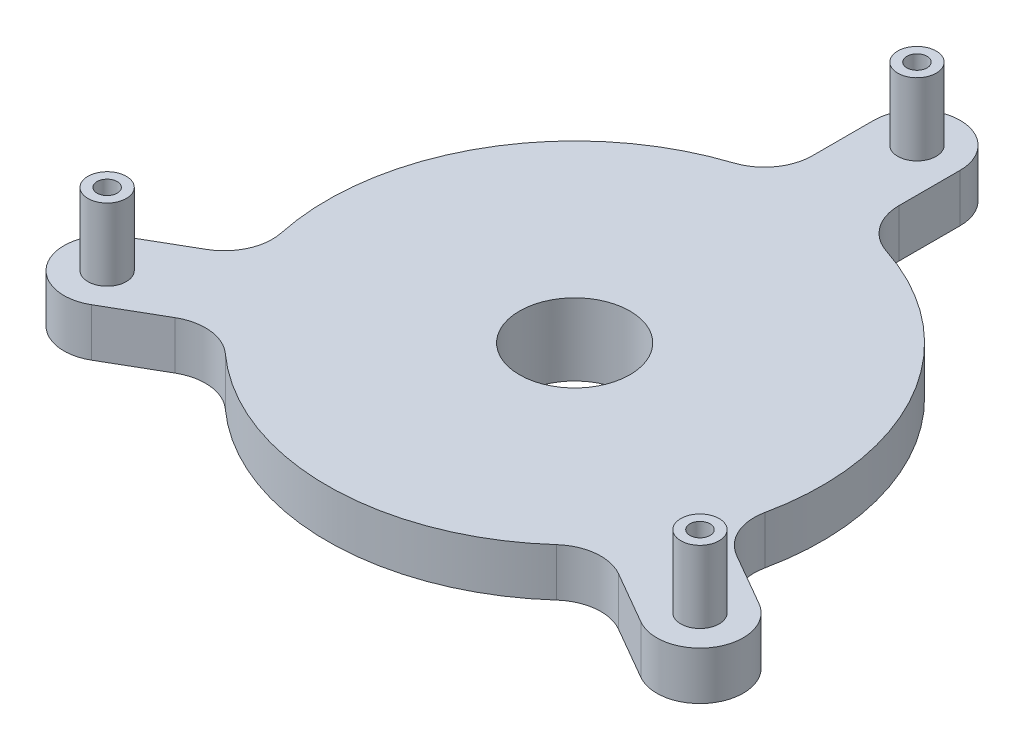
ISO-10303-21;
HEADER;
FILE_DESCRIPTION(('STEP AP214'),'2;1');
FILE_NAME('part.step','',(''),(''),'','','');
FILE_SCHEMA(('AUTOMOTIVE_DESIGN { 1 0 10303 214 1 1 1 1 }'));
ENDSEC;
DATA;
#1=APPLICATION_CONTEXT('core data for automotive mechanical design processes');
#2=APPLICATION_PROTOCOL_DEFINITION('international standard','automotive_design',2000,#1);
#3=PRODUCT_CONTEXT('',#1,'mechanical');
#4=PRODUCT('Part','Part','',(#3));
#5=PRODUCT_RELATED_PRODUCT_CATEGORY('part','',(#4));
#6=PRODUCT_DEFINITION_FORMATION('','',#4);
#7=PRODUCT_DEFINITION_CONTEXT('part definition',#1,'design');
#8=PRODUCT_DEFINITION('design','',#6,#7);
#9=PRODUCT_DEFINITION_SHAPE('','',#8);
#10=(LENGTH_UNIT() NAMED_UNIT(*) SI_UNIT(.MILLI.,.METRE.));
#11=(NAMED_UNIT(*) PLANE_ANGLE_UNIT() SI_UNIT($,.RADIAN.));
#12=(NAMED_UNIT(*) SI_UNIT($,.STERADIAN.) SOLID_ANGLE_UNIT());
#13=UNCERTAINTY_MEASURE_WITH_UNIT(LENGTH_MEASURE(1.E-05),#10,'distance_accuracy_value','');
#14=(GEOMETRIC_REPRESENTATION_CONTEXT(3) GLOBAL_UNCERTAINTY_ASSIGNED_CONTEXT((#13)) GLOBAL_UNIT_ASSIGNED_CONTEXT((#10,
#11,#12)) REPRESENTATION_CONTEXT('',''));
#15=CARTESIAN_POINT('',(0.,0.,0.));
#16=DIRECTION('',(0.,0.,1.));
#17=DIRECTION('',(1.,0.,0.));
#18=AXIS2_PLACEMENT_3D('',#15,#16,#17);
#19=CARTESIAN_POINT('',(0.,5.,0.));
#20=DIRECTION('',(0.,-1.,0.));
#21=DIRECTION('',(0.,0.,-1.));
#22=AXIS2_PLACEMENT_3D('',#19,#20,#21);
#23=CYLINDRICAL_SURFACE('',#22,11.5);
#24=CARTESIAN_POINT('',(0.,5.,0.));
#25=DIRECTION('',(0.,1.,0.));
#26=DIRECTION('',(0.,0.,1.));
#27=AXIS2_PLACEMENT_3D('',#24,#25,#26);
#28=CIRCLE('',#27,11.5);
#29=CARTESIAN_POINT('',(0.,5.,11.5));
#30=VERTEX_POINT('',#29);
#31=EDGE_CURVE('E339',#30,#30,#28,.T.);
#32=ORIENTED_EDGE('',*,*,#31,.T.);
#33=EDGE_LOOP('',(#32));
#34=FACE_BOUND('',#33,.T.);
#35=CARTESIAN_POINT('',(0.,-10.,0.));
#36=DIRECTION('',(0.,-1.,0.));
#37=DIRECTION('',(0.,0.,-1.));
#38=AXIS2_PLACEMENT_3D('',#35,#36,#37);
#39=CIRCLE('',#38,11.5);
#40=CARTESIAN_POINT('',(0.,-10.,-11.5));
#41=VERTEX_POINT('',#40);
#42=EDGE_CURVE('E598',#41,#41,#39,.T.);
#43=ORIENTED_EDGE('',*,*,#42,.T.);
#44=EDGE_LOOP('',(#43));
#45=FACE_BOUND('',#44,.T.);
#46=ADVANCED_FACE('F39',(#34,#45),#23,.F.);
#47=CARTESIAN_POINT('',(0.,5.,0.));
#48=DIRECTION('',(0.,1.,0.));
#49=DIRECTION('',(0.,0.,1.));
#50=AXIS2_PLACEMENT_3D('',#47,#48,#49);
#51=PLANE('',#50);
#52=CARTESIAN_POINT('',(0.,5.,0.));
#53=DIRECTION('',(0.,1.,0.));
#54=DIRECTION('',(0.,0.,1.));
#55=AXIS2_PLACEMENT_3D('',#52,#53,#54);
#56=CIRCLE('',#55,51.5);
#57=CARTESIAN_POINT('',(34.4632001330762,5.,38.2692805862292));
#58=VERTEX_POINT('',#57);
#59=CARTESIAN_POINT('',(-34.4632001330762,5.,38.2692805862292));
#60=VERTEX_POINT('',#59);
#61=EDGE_CURVE('E43',#58,#60,#56,.F.);
#62=ORIENTED_EDGE('',*,*,#61,.F.);
#63=CARTESIAN_POINT('',(41.1550836540618,5.,45.7002088553999));
#64=DIRECTION('',(0.,1.,0.));
#65=DIRECTION('',(0.,0.,1.));
#66=AXIS2_PLACEMENT_3D('',#63,#64,#65);
#67=CIRCLE('',#66,10.);
#68=CARTESIAN_POINT('',(46.1550836540618,5.,37.0399548175555));
#69=VERTEX_POINT('',#68);
#70=EDGE_CURVE('E358',#58,#69,#67,.F.);
#71=ORIENTED_EDGE('',*,*,#70,.T.);
#72=DIRECTION('',(0.866025403784439,0.,0.5));
#73=VECTOR('',#72,1.);
#74=CARTESIAN_POINT('',(-4.50000000000001,5.,7.79422863405997));
#75=LINE('',#74,#73);
#76=CARTESIAN_POINT('',(57.2043100196413,5.,43.41922863406));
#77=VERTEX_POINT('',#76);
#78=EDGE_CURVE('E362',#69,#77,#75,.T.);
#79=ORIENTED_EDGE('',*,*,#78,.T.);
#80=CARTESIAN_POINT('',(61.7043100196413,5.,35.625));
#81=DIRECTION('',(0.,1.,0.));
#82=DIRECTION('',(0.,0.,1.));
#83=AXIS2_PLACEMENT_3D('',#80,#81,#82);
#84=CIRCLE('',#83,9.00000000000001);
#85=CARTESIAN_POINT('',(66.2043100196413,5.,27.8307713659401));
#86=VERTEX_POINT('',#85);
#87=EDGE_CURVE('E174',#86,#77,#84,.F.);
#88=ORIENTED_EDGE('',*,*,#87,.F.);
#89=DIRECTION('',(0.866025403784439,0.,0.5));
#90=VECTOR('',#89,1.);
#91=CARTESIAN_POINT('',(4.50000000000001,5.,-7.79422863405997));
#92=LINE('',#91,#90);
#93=CARTESIAN_POINT('',(55.1550836540618,5.,21.4514975494356));
#94=VERTEX_POINT('',#93);
#95=EDGE_CURVE('E367',#94,#86,#92,.T.);
#96=ORIENTED_EDGE('',*,*,#95,.F.);
#97=CARTESIAN_POINT('',(60.1550836540618,5.,12.7912435115912));
#98=DIRECTION('',(0.,1.,0.));
#99=DIRECTION('',(0.,0.,1.));
#100=AXIS2_PLACEMENT_3D('',#97,#98,#99);
#101=CIRCLE('',#100,10.);
#102=CARTESIAN_POINT('',(50.3737692387672,5.,10.7113665178366));
#103=VERTEX_POINT('',#102);
#104=EDGE_CURVE('E370',#103,#94,#101,.T.);
#105=ORIENTED_EDGE('',*,*,#104,.F.);
#106=CARTESIAN_POINT('',(0.,5.,0.));
#107=DIRECTION('',(0.,1.,0.));
#108=DIRECTION('',(0.,0.,1.));
#109=AXIS2_PLACEMENT_3D('',#106,#107,#108);
#110=CIRCLE('',#109,51.5);
#111=CARTESIAN_POINT('',(15.9105691056911,5.,-48.9806471040658));
#112=VERTEX_POINT('',#111);
#113=EDGE_CURVE('E373',#112,#103,#110,.F.);
#114=ORIENTED_EDGE('',*,*,#113,.F.);
#115=CARTESIAN_POINT('',(19.,5.,-58.4914523669912));
#116=DIRECTION('',(0.,1.,0.));
#117=DIRECTION('',(0.,0.,1.));
#118=AXIS2_PLACEMENT_3D('',#115,#116,#117);
#119=CIRCLE('',#118,10.);
#120=CARTESIAN_POINT('',(9.00000000000001,5.,-58.4914523669912));
#121=VERTEX_POINT('',#120);
#122=EDGE_CURVE('E376',#112,#121,#119,.F.);
#123=ORIENTED_EDGE('',*,*,#122,.T.);
#124=DIRECTION('',(0.,0.,-1.));
#125=VECTOR('',#124,1.);
#126=CARTESIAN_POINT('',(9.00000000000001,5.,0.));
#127=LINE('',#126,#125);
#128=CARTESIAN_POINT('',(9.00000000000001,5.,-71.25));
#129=VERTEX_POINT('',#128);
#130=EDGE_CURVE('E380',#121,#129,#127,.T.);
#131=ORIENTED_EDGE('',*,*,#130,.T.);
#132=CARTESIAN_POINT('',(0.,5.,-71.25));
#133=DIRECTION('',(0.,1.,0.));
#134=DIRECTION('',(0.,0.,1.));
#135=AXIS2_PLACEMENT_3D('',#132,#133,#134);
#136=CIRCLE('',#135,9.00000000000001);
#137=CARTESIAN_POINT('',(-9.00000000000001,5.,-71.25));
#138=VERTEX_POINT('',#137);
#139=EDGE_CURVE('E384',#138,#129,#136,.F.);
#140=ORIENTED_EDGE('',*,*,#139,.F.);
#141=DIRECTION('',(0.,0.,-1.));
#142=VECTOR('',#141,1.);
#143=CARTESIAN_POINT('',(-8.99999999999999,5.,0.));
#144=LINE('',#143,#142);
#145=CARTESIAN_POINT('',(-9.,5.,-58.4914523669912));
#146=VERTEX_POINT('',#145);
#147=EDGE_CURVE('E387',#146,#138,#144,.T.);
#148=ORIENTED_EDGE('',*,*,#147,.F.);
#149=CARTESIAN_POINT('',(-19.,5.,-58.4914523669912));
#150=DIRECTION('',(0.,1.,0.));
#151=DIRECTION('',(0.,0.,1.));
#152=AXIS2_PLACEMENT_3D('',#149,#150,#151);
#153=CIRCLE('',#152,10.);
#154=CARTESIAN_POINT('',(-15.9105691056911,5.,-48.9806471040658));
#155=VERTEX_POINT('',#154);
#156=EDGE_CURVE('E390',#155,#146,#153,.T.);
#157=ORIENTED_EDGE('',*,*,#156,.F.);
#158=CARTESIAN_POINT('',(0.,5.,0.));
#159=DIRECTION('',(0.,1.,0.));
#160=DIRECTION('',(0.,0.,1.));
#161=AXIS2_PLACEMENT_3D('',#158,#159,#160);
#162=CIRCLE('',#161,51.5);
#163=CARTESIAN_POINT('',(-50.3737692387672,5.,10.7113665178365));
#164=VERTEX_POINT('',#163);
#165=EDGE_CURVE('E393',#164,#155,#162,.F.);
#166=ORIENTED_EDGE('',*,*,#165,.F.);
#167=CARTESIAN_POINT('',(-60.1550836540618,5.,12.7912435115912));
#168=DIRECTION('',(0.,1.,0.));
#169=DIRECTION('',(0.,0.,1.));
#170=AXIS2_PLACEMENT_3D('',#167,#168,#169);
#171=CIRCLE('',#170,10.);
#172=CARTESIAN_POINT('',(-55.1550836540618,5.,21.4514975494356));
#173=VERTEX_POINT('',#172);
#174=EDGE_CURVE('E396',#164,#173,#171,.F.);
#175=ORIENTED_EDGE('',*,*,#174,.T.);
#176=DIRECTION('',(-0.866025403784436,0.,0.500000000000004));
#177=VECTOR('',#176,1.);
#178=CARTESIAN_POINT('',(-4.5000000000002,5.,-7.7942286340602));
#179=LINE('',#178,#177);
#180=CARTESIAN_POINT('',(-66.2043100196413,5.,27.8307713659401));
#181=VERTEX_POINT('',#180);
#182=EDGE_CURVE('E400',#173,#181,#179,.T.);
#183=ORIENTED_EDGE('',*,*,#182,.T.);
#184=CARTESIAN_POINT('',(-61.7043100196412,5.,35.625));
#185=DIRECTION('',(0.,1.,0.));
#186=DIRECTION('',(0.,0.,1.));
#187=AXIS2_PLACEMENT_3D('',#184,#185,#186);
#188=CIRCLE('',#187,9.00000000000001);
#189=CARTESIAN_POINT('',(-57.2043100196413,5.,43.41922863406));
#190=VERTEX_POINT('',#189);
#191=EDGE_CURVE('E404',#190,#181,#188,.F.);
#192=ORIENTED_EDGE('',*,*,#191,.F.);
#193=DIRECTION('',(-0.866025403784437,0.,0.500000000000003));
#194=VECTOR('',#193,1.);
#195=CARTESIAN_POINT('',(4.49999999999994,5.,7.79422863405979));
#196=LINE('',#195,#194);
#197=CARTESIAN_POINT('',(-46.1550836540618,5.,37.0399548175555));
#198=VERTEX_POINT('',#197);
#199=EDGE_CURVE('E407',#198,#190,#196,.T.);
#200=ORIENTED_EDGE('',*,*,#199,.F.);
#201=CARTESIAN_POINT('',(-41.1550836540618,5.,45.7002088553999));
#202=DIRECTION('',(0.,1.,0.));
#203=DIRECTION('',(0.,0.,1.));
#204=AXIS2_PLACEMENT_3D('',#201,#202,#203);
#205=CIRCLE('',#204,9.99999999999998);
#206=EDGE_CURVE('E409',#60,#198,#205,.T.);
#207=ORIENTED_EDGE('',*,*,#206,.F.);
#208=EDGE_LOOP('',(#62,#71,#79,#88,#96,#105,#114,#123,#131,#140,#148,#157,#166,#175,#183,#192,
#200,#207));
#209=FACE_BOUND('',#208,.T.);
#210=CARTESIAN_POINT('',(-61.7043100196412,5.,35.625));
#211=DIRECTION('',(0.,1.,0.));
#212=DIRECTION('',(0.,0.,1.));
#213=AXIS2_PLACEMENT_3D('',#210,#211,#212);
#214=CIRCLE('',#213,4.);
#215=CARTESIAN_POINT('',(-61.7043100196412,5.,39.625));
#216=VERTEX_POINT('',#215);
#217=EDGE_CURVE('E310',#216,#216,#214,.T.);
#218=ORIENTED_EDGE('',*,*,#217,.F.);
#219=EDGE_LOOP('',(#218));
#220=FACE_BOUND('',#219,.T.);
#221=CARTESIAN_POINT('',(61.7043100196413,5.,35.625));
#222=DIRECTION('',(0.,1.,0.));
#223=DIRECTION('',(0.,0.,1.));
#224=AXIS2_PLACEMENT_3D('',#221,#222,#223);
#225=CIRCLE('',#224,3.99999999999999);
#226=CARTESIAN_POINT('',(61.7043100196413,5.,39.625));
#227=VERTEX_POINT('',#226);
#228=EDGE_CURVE('E322',#227,#227,#225,.T.);
#229=ORIENTED_EDGE('',*,*,#228,.F.);
#230=EDGE_LOOP('',(#229));
#231=FACE_BOUND('',#230,.T.);
#232=CARTESIAN_POINT('',(0.,5.,-71.25));
#233=DIRECTION('',(0.,1.,0.));
#234=DIRECTION('',(0.,0.,1.));
#235=AXIS2_PLACEMENT_3D('',#232,#233,#234);
#236=CIRCLE('',#235,4.);
#237=CARTESIAN_POINT('',(0.,5.,-67.25));
#238=VERTEX_POINT('',#237);
#239=EDGE_CURVE('E334',#238,#238,#236,.T.);
#240=ORIENTED_EDGE('',*,*,#239,.F.);
#241=EDGE_LOOP('',(#240));
#242=FACE_BOUND('',#241,.T.);
#243=ORIENTED_EDGE('',*,*,#31,.F.);
#244=EDGE_LOOP('',(#243));
#245=FACE_BOUND('',#244,.T.);
#246=ADVANCED_FACE('F41',(#209,#220,#231,#242,#245),#51,.T.);
#247=CARTESIAN_POINT('',(0.,20.,-71.25));
#248=DIRECTION('',(0.,1.,0.));
#249=DIRECTION('',(0.,0.,1.));
#250=AXIS2_PLACEMENT_3D('',#247,#248,#249);
#251=PLANE('',#250);
#252=CARTESIAN_POINT('',(0.,20.,-71.25));
#253=DIRECTION('',(0.,1.,0.));
#254=DIRECTION('',(0.,0.,1.));
#255=AXIS2_PLACEMENT_3D('',#252,#253,#254);
#256=CIRCLE('',#255,4.);
#257=CARTESIAN_POINT('',(0.,20.,-67.25));
#258=VERTEX_POINT('',#257);
#259=EDGE_CURVE('E335',#258,#258,#256,.T.);
#260=ORIENTED_EDGE('',*,*,#259,.T.);
#261=EDGE_LOOP('',(#260));
#262=FACE_BOUND('',#261,.T.);
#263=CARTESIAN_POINT('',(0.,20.,-71.25));
#264=DIRECTION('',(0.,1.,0.));
#265=DIRECTION('',(0.,0.,1.));
#266=AXIS2_PLACEMENT_3D('',#263,#264,#265);
#267=CIRCLE('',#266,2.1);
#268=CARTESIAN_POINT('',(0.,20.,-69.15));
#269=VERTEX_POINT('',#268);
#270=EDGE_CURVE('E327',#269,#269,#267,.T.);
#271=ORIENTED_EDGE('',*,*,#270,.F.);
#272=EDGE_LOOP('',(#271));
#273=FACE_BOUND('',#272,.T.);
#274=ADVANCED_FACE('F453',(#262,#273),#251,.T.);
#275=CARTESIAN_POINT('',(0.,20.,-71.25));
#276=DIRECTION('',(0.,-1.,0.));
#277=DIRECTION('',(0.,0.,-1.));
#278=AXIS2_PLACEMENT_3D('',#275,#276,#277);
#279=CYLINDRICAL_SURFACE('',#278,4.);
#280=ORIENTED_EDGE('',*,*,#259,.F.);
#281=EDGE_LOOP('',(#280));
#282=FACE_BOUND('',#281,.T.);
#283=ORIENTED_EDGE('',*,*,#239,.T.);
#284=EDGE_LOOP('',(#283));
#285=FACE_BOUND('',#284,.T.);
#286=ADVANCED_FACE('F458',(#282,#285),#279,.T.);
#287=CARTESIAN_POINT('',(0.,20.,-71.25));
#288=DIRECTION('',(0.,-1.,0.));
#289=DIRECTION('',(0.,0.,-1.));
#290=AXIS2_PLACEMENT_3D('',#287,#288,#289);
#291=CYLINDRICAL_SURFACE('',#290,2.1);
#292=ORIENTED_EDGE('',*,*,#270,.T.);
#293=EDGE_LOOP('',(#292));
#294=FACE_BOUND('',#293,.T.);
#295=CARTESIAN_POINT('',(0.,5.,-71.25));
#296=DIRECTION('',(0.,1.,0.));
#297=DIRECTION('',(0.,0.,1.));
#298=AXIS2_PLACEMENT_3D('',#295,#296,#297);
#299=CIRCLE('',#298,2.1);
#300=CARTESIAN_POINT('',(0.,5.,-69.15));
#301=VERTEX_POINT('',#300);
#302=EDGE_CURVE('E346',#301,#301,#299,.F.);
#303=ORIENTED_EDGE('',*,*,#302,.T.);
#304=EDGE_LOOP('',(#303));
#305=FACE_BOUND('',#304,.T.);
#306=ADVANCED_FACE('F461',(#294,#305),#291,.F.);
#307=ORIENTED_EDGE('',*,*,#302,.F.);
#308=EDGE_LOOP('',(#307));
#309=FACE_BOUND('',#308,.T.);
#310=ADVANCED_FACE('F455',(#309),#51,.T.);
#311=CARTESIAN_POINT('',(61.7043100196413,20.,35.625));
#312=DIRECTION('',(0.,1.,0.));
#313=DIRECTION('',(0.,0.,1.));
#314=AXIS2_PLACEMENT_3D('',#311,#312,#313);
#315=PLANE('',#314);
#316=CARTESIAN_POINT('',(61.7043100196413,20.,35.625));
#317=DIRECTION('',(0.,1.,0.));
#318=DIRECTION('',(0.,0.,1.));
#319=AXIS2_PLACEMENT_3D('',#316,#317,#318);
#320=CIRCLE('',#319,3.99999999999999);
#321=CARTESIAN_POINT('',(61.7043100196413,20.,39.625));
#322=VERTEX_POINT('',#321);
#323=EDGE_CURVE('E323',#322,#322,#320,.T.);
#324=ORIENTED_EDGE('',*,*,#323,.T.);
#325=EDGE_LOOP('',(#324));
#326=FACE_BOUND('',#325,.T.);
#327=CARTESIAN_POINT('',(61.7043100196413,20.,35.625));
#328=DIRECTION('',(0.,1.,0.));
#329=DIRECTION('',(0.,0.,1.));
#330=AXIS2_PLACEMENT_3D('',#327,#328,#329);
#331=CIRCLE('',#330,2.1);
#332=CARTESIAN_POINT('',(61.7043100196413,20.,37.725));
#333=VERTEX_POINT('',#332);
#334=EDGE_CURVE('E315',#333,#333,#331,.T.);
#335=ORIENTED_EDGE('',*,*,#334,.F.);
#336=EDGE_LOOP('',(#335));
#337=FACE_BOUND('',#336,.T.);
#338=ADVANCED_FACE('F473',(#326,#337),#315,.T.);
#339=CARTESIAN_POINT('',(61.7043100196413,20.,35.625));
#340=DIRECTION('',(0.,-1.,0.));
#341=DIRECTION('',(0.,0.,-1.));
#342=AXIS2_PLACEMENT_3D('',#339,#340,#341);
#343=CYLINDRICAL_SURFACE('',#342,3.99999999999999);
#344=ORIENTED_EDGE('',*,*,#323,.F.);
#345=EDGE_LOOP('',(#344));
#346=FACE_BOUND('',#345,.T.);
#347=ORIENTED_EDGE('',*,*,#228,.T.);
#348=EDGE_LOOP('',(#347));
#349=FACE_BOUND('',#348,.T.);
#350=ADVANCED_FACE('F469',(#346,#349),#343,.T.);
#351=CARTESIAN_POINT('',(61.7043100196413,20.,35.625));
#352=DIRECTION('',(0.,-1.,0.));
#353=DIRECTION('',(0.,0.,-1.));
#354=AXIS2_PLACEMENT_3D('',#351,#352,#353);
#355=CYLINDRICAL_SURFACE('',#354,2.1);
#356=ORIENTED_EDGE('',*,*,#334,.T.);
#357=EDGE_LOOP('',(#356));
#358=FACE_BOUND('',#357,.T.);
#359=CARTESIAN_POINT('',(61.7043100196413,5.,35.625));
#360=DIRECTION('',(0.,1.,0.));
#361=DIRECTION('',(0.,0.,1.));
#362=AXIS2_PLACEMENT_3D('',#359,#360,#361);
#363=CIRCLE('',#362,2.1);
#364=CARTESIAN_POINT('',(61.7043100196413,5.,37.725));
#365=VERTEX_POINT('',#364);
#366=EDGE_CURVE('E350',#365,#365,#363,.F.);
#367=ORIENTED_EDGE('',*,*,#366,.T.);
#368=EDGE_LOOP('',(#367));
#369=FACE_BOUND('',#368,.T.);
#370=ADVANCED_FACE('F472',(#358,#369),#355,.F.);
#371=ORIENTED_EDGE('',*,*,#366,.F.);
#372=EDGE_LOOP('',(#371));
#373=FACE_BOUND('',#372,.T.);
#374=ADVANCED_FACE('F480',(#373),#51,.T.);
#375=CARTESIAN_POINT('',(-61.7043100196412,20.,35.625));
#376=DIRECTION('',(0.,1.,0.));
#377=DIRECTION('',(0.,0.,1.));
#378=AXIS2_PLACEMENT_3D('',#375,#376,#377);
#379=PLANE('',#378);
#380=CARTESIAN_POINT('',(-61.7043100196412,20.,35.625));
#381=DIRECTION('',(0.,1.,0.));
#382=DIRECTION('',(0.,0.,1.));
#383=AXIS2_PLACEMENT_3D('',#380,#381,#382);
#384=CIRCLE('',#383,4.);
#385=CARTESIAN_POINT('',(-61.7043100196412,20.,39.625));
#386=VERTEX_POINT('',#385);
#387=EDGE_CURVE('E311',#386,#386,#384,.T.);
#388=ORIENTED_EDGE('',*,*,#387,.T.);
#389=EDGE_LOOP('',(#388));
#390=FACE_BOUND('',#389,.T.);
#391=CARTESIAN_POINT('',(-61.7043100196412,20.,35.625));
#392=DIRECTION('',(0.,1.,0.));
#393=DIRECTION('',(0.,0.,1.));
#394=AXIS2_PLACEMENT_3D('',#391,#392,#393);
#395=CIRCLE('',#394,2.1);
#396=CARTESIAN_POINT('',(-61.7043100196412,20.,37.725));
#397=VERTEX_POINT('',#396);
#398=EDGE_CURVE('E306',#397,#397,#395,.T.);
#399=ORIENTED_EDGE('',*,*,#398,.F.);
#400=EDGE_LOOP('',(#399));
#401=FACE_BOUND('',#400,.T.);
#402=ADVANCED_FACE('F486',(#390,#401),#379,.T.);
#403=CARTESIAN_POINT('',(-61.7043100196412,20.,35.625));
#404=DIRECTION('',(0.,-1.,0.));
#405=DIRECTION('',(0.,0.,-1.));
#406=AXIS2_PLACEMENT_3D('',#403,#404,#405);
#407=CYLINDRICAL_SURFACE('',#406,4.);
#408=ORIENTED_EDGE('',*,*,#387,.F.);
#409=EDGE_LOOP('',(#408));
#410=FACE_BOUND('',#409,.T.);
#411=ORIENTED_EDGE('',*,*,#217,.T.);
#412=EDGE_LOOP('',(#411));
#413=FACE_BOUND('',#412,.T.);
#414=ADVANCED_FACE('F482',(#410,#413),#407,.T.);
#415=CARTESIAN_POINT('',(-61.7043100196412,20.,35.625));
#416=DIRECTION('',(0.,-1.,0.));
#417=DIRECTION('',(0.,0.,-1.));
#418=AXIS2_PLACEMENT_3D('',#415,#416,#417);
#419=CYLINDRICAL_SURFACE('',#418,2.1);
#420=ORIENTED_EDGE('',*,*,#398,.T.);
#421=EDGE_LOOP('',(#420));
#422=FACE_BOUND('',#421,.T.);
#423=CARTESIAN_POINT('',(-61.7043100196412,5.,35.625));
#424=DIRECTION('',(0.,1.,0.));
#425=DIRECTION('',(0.,0.,1.));
#426=AXIS2_PLACEMENT_3D('',#423,#424,#425);
#427=CIRCLE('',#426,2.1);
#428=CARTESIAN_POINT('',(-61.7043100196412,5.,37.725));
#429=VERTEX_POINT('',#428);
#430=EDGE_CURVE('E354',#429,#429,#427,.F.);
#431=ORIENTED_EDGE('',*,*,#430,.T.);
#432=EDGE_LOOP('',(#431));
#433=FACE_BOUND('',#432,.T.);
#434=ADVANCED_FACE('F485',(#422,#433),#419,.F.);
#435=ORIENTED_EDGE('',*,*,#430,.F.);
#436=EDGE_LOOP('',(#435));
#437=FACE_BOUND('',#436,.T.);
#438=ADVANCED_FACE('F454',(#437),#51,.T.);
#439=CARTESIAN_POINT('',(0.,20.,0.));
#440=DIRECTION('',(0.,-1.,0.));
#441=DIRECTION('',(0.,0.,-1.));
#442=AXIS2_PLACEMENT_3D('',#439,#440,#441);
#443=CYLINDRICAL_SURFACE('',#442,51.5);
#444=DIRECTION('',(0.,-1.,0.));
#445=VECTOR('',#444,1.);
#446=CARTESIAN_POINT('',(34.4632001330762,20.,38.2692805862292));
#447=LINE('',#446,#445);
#448=CARTESIAN_POINT('',(34.4632001330762,-5.,38.2692805862292));
#449=VERTEX_POINT('',#448);
#450=EDGE_CURVE('E186',#58,#449,#447,.T.);
#451=ORIENTED_EDGE('',*,*,#450,.F.);
#452=ORIENTED_EDGE('',*,*,#61,.T.);
#453=DIRECTION('',(0.,-1.,0.));
#454=VECTOR('',#453,1.);
#455=CARTESIAN_POINT('',(-34.4632001330762,20.,38.2692805862292));
#456=LINE('',#455,#454);
#457=CARTESIAN_POINT('',(-34.4632001330762,-5.,38.2692805862292));
#458=VERTEX_POINT('',#457);
#459=EDGE_CURVE('E303',#60,#458,#456,.T.);
#460=ORIENTED_EDGE('',*,*,#459,.T.);
#461=CARTESIAN_POINT('',(0.,-5.,0.));
#462=DIRECTION('',(0.,-1.,0.));
#463=DIRECTION('',(0.,0.,-1.));
#464=AXIS2_PLACEMENT_3D('',#461,#462,#463);
#465=CIRCLE('',#464,51.5);
#466=EDGE_CURVE('E203',#449,#458,#465,.T.);
#467=ORIENTED_EDGE('',*,*,#466,.F.);
#468=EDGE_LOOP('',(#451,#452,#460,#467));
#469=FACE_BOUND('',#468,.T.);
#470=ADVANCED_FACE('F435',(#469),#443,.T.);
#471=CARTESIAN_POINT('',(-41.1550836540618,20.,45.7002088553999));
#472=DIRECTION('',(0.,-1.,0.));
#473=DIRECTION('',(0.,0.,-1.));
#474=AXIS2_PLACEMENT_3D('',#471,#472,#473);
#475=CYLINDRICAL_SURFACE('',#474,9.99999999999998);
#476=ORIENTED_EDGE('',*,*,#459,.F.);
#477=ORIENTED_EDGE('',*,*,#206,.T.);
#478=DIRECTION('',(0.,-1.,0.));
#479=VECTOR('',#478,1.);
#480=CARTESIAN_POINT('',(-46.1550836540618,20.,37.0399548175555));
#481=LINE('',#480,#479);
#482=CARTESIAN_POINT('',(-46.1550836540618,-5.,37.0399548175555));
#483=VERTEX_POINT('',#482);
#484=EDGE_CURVE('E300',#198,#483,#481,.T.);
#485=ORIENTED_EDGE('',*,*,#484,.T.);
#486=CARTESIAN_POINT('',(-41.1550836540618,-5.,45.7002088553999));
#487=DIRECTION('',(0.,-1.,0.));
#488=DIRECTION('',(0.,0.,-1.));
#489=AXIS2_PLACEMENT_3D('',#486,#487,#488);
#490=CIRCLE('',#489,9.99999999999998);
#491=EDGE_CURVE('E236',#483,#458,#490,.T.);
#492=ORIENTED_EDGE('',*,*,#491,.T.);
#493=EDGE_LOOP('',(#476,#477,#485,#492));
#494=FACE_BOUND('',#493,.T.);
#495=ADVANCED_FACE('F415',(#494),#475,.F.);
#496=CARTESIAN_POINT('',(4.49999999999994,20.,7.79422863405978));
#497=DIRECTION('',(-0.500000000000003,0.,-0.866025403784437));
#498=DIRECTION('',(-0.866025403784437,0.,0.500000000000003));
#499=AXIS2_PLACEMENT_3D('',#496,#497,#498);
#500=PLANE('',#499);
#501=ORIENTED_EDGE('',*,*,#484,.F.);
#502=ORIENTED_EDGE('',*,*,#199,.T.);
#503=DIRECTION('',(0.,-1.,0.));
#504=VECTOR('',#503,1.);
#505=CARTESIAN_POINT('',(-57.2043100196413,20.,43.41922863406));
#506=LINE('',#505,#504);
#507=CARTESIAN_POINT('',(-57.2043100196413,-5.,43.41922863406));
#508=VERTEX_POINT('',#507);
#509=EDGE_CURVE('E297',#190,#508,#506,.T.);
#510=ORIENTED_EDGE('',*,*,#509,.T.);
#511=DIRECTION('',(-0.866025403784437,0.,0.500000000000003));
#512=VECTOR('',#511,1.);
#513=CARTESIAN_POINT('',(-46.1550836540618,-5.,37.0399548175555));
#514=LINE('',#513,#512);
#515=EDGE_CURVE('E244',#483,#508,#514,.T.);
#516=ORIENTED_EDGE('',*,*,#515,.F.);
#517=EDGE_LOOP('',(#501,#502,#510,#516));
#518=FACE_BOUND('',#517,.T.);
#519=ADVANCED_FACE('F420',(#518),#500,.F.);
#520=CARTESIAN_POINT('',(-61.7043100196412,20.,35.625));
#521=DIRECTION('',(0.,-1.,0.));
#522=DIRECTION('',(0.,0.,-1.));
#523=AXIS2_PLACEMENT_3D('',#520,#521,#522);
#524=CYLINDRICAL_SURFACE('',#523,9.00000000000001);
#525=ORIENTED_EDGE('',*,*,#509,.F.);
#526=ORIENTED_EDGE('',*,*,#191,.T.);
#527=DIRECTION('',(0.,-1.,0.));
#528=VECTOR('',#527,1.);
#529=CARTESIAN_POINT('',(-66.2043100196413,20.,27.8307713659401));
#530=LINE('',#529,#528);
#531=CARTESIAN_POINT('',(-66.2043100196413,-5.,27.8307713659401));
#532=VERTEX_POINT('',#531);
#533=EDGE_CURVE('E294',#181,#532,#530,.T.);
#534=ORIENTED_EDGE('',*,*,#533,.T.);
#535=CARTESIAN_POINT('',(-61.7043100196412,-5.,35.625));
#536=DIRECTION('',(0.,-1.,0.));
#537=DIRECTION('',(0.,0.,-1.));
#538=AXIS2_PLACEMENT_3D('',#535,#536,#537);
#539=CIRCLE('',#538,9.00000000000002);
#540=EDGE_CURVE('E240',#508,#532,#539,.T.);
#541=ORIENTED_EDGE('',*,*,#540,.F.);
#542=EDGE_LOOP('',(#525,#526,#534,#541));
#543=FACE_BOUND('',#542,.T.);
#544=ADVANCED_FACE('F427',(#543),#524,.T.);
#545=CARTESIAN_POINT('',(-4.5000000000002,20.,-7.7942286340602));
#546=DIRECTION('',(-0.500000000000004,0.,-0.866025403784436));
#547=DIRECTION('',(-0.866025403784436,0.,0.500000000000004));
#548=AXIS2_PLACEMENT_3D('',#545,#546,#547);
#549=PLANE('',#548);
#550=DIRECTION('',(0.,-1.,0.));
#551=VECTOR('',#550,1.);
#552=CARTESIAN_POINT('',(-55.1550836540618,20.,21.4514975494356));
#553=LINE('',#552,#551);
#554=CARTESIAN_POINT('',(-55.1550836540618,-5.,21.4514975494356));
#555=VERTEX_POINT('',#554);
#556=EDGE_CURVE('E291',#173,#555,#553,.T.);
#557=ORIENTED_EDGE('',*,*,#556,.T.);
#558=DIRECTION('',(0.866025403784437,0.,-0.500000000000002));
#559=VECTOR('',#558,1.);
#560=CARTESIAN_POINT('',(-66.2043100196413,-5.,27.8307713659401));
#561=LINE('',#560,#559);
#562=EDGE_CURVE('E232',#532,#555,#561,.T.);
#563=ORIENTED_EDGE('',*,*,#562,.F.);
#564=ORIENTED_EDGE('',*,*,#533,.F.);
#565=ORIENTED_EDGE('',*,*,#182,.F.);
#566=EDGE_LOOP('',(#557,#563,#564,#565));
#567=FACE_BOUND('',#566,.T.);
#568=ADVANCED_FACE('F431',(#567),#549,.T.);
#569=CARTESIAN_POINT('',(-60.1550836540618,20.,12.7912435115912));
#570=DIRECTION('',(0.,-1.,0.));
#571=DIRECTION('',(0.,0.,-1.));
#572=AXIS2_PLACEMENT_3D('',#569,#570,#571);
#573=CYLINDRICAL_SURFACE('',#572,10.);
#574=DIRECTION('',(0.,-1.,0.));
#575=VECTOR('',#574,1.);
#576=CARTESIAN_POINT('',(-50.3737692387672,20.,10.7113665178365));
#577=LINE('',#576,#575);
#578=CARTESIAN_POINT('',(-50.3737692387672,-5.,10.7113665178365));
#579=VERTEX_POINT('',#578);
#580=EDGE_CURVE('E288',#164,#579,#577,.T.);
#581=ORIENTED_EDGE('',*,*,#580,.T.);
#582=CARTESIAN_POINT('',(-60.1550836540618,-5.,12.7912435115912));
#583=DIRECTION('',(0.,-1.,0.));
#584=DIRECTION('',(0.,0.,-1.));
#585=AXIS2_PLACEMENT_3D('',#582,#583,#584);
#586=CIRCLE('',#585,10.);
#587=EDGE_CURVE('E228',#579,#555,#586,.T.);
#588=ORIENTED_EDGE('',*,*,#587,.T.);
#589=ORIENTED_EDGE('',*,*,#556,.F.);
#590=ORIENTED_EDGE('',*,*,#174,.F.);
#591=EDGE_LOOP('',(#581,#588,#589,#590));
#592=FACE_BOUND('',#591,.T.);
#593=ADVANCED_FACE('F504',(#592),#573,.F.);
#594=CARTESIAN_POINT('',(0.,20.,0.));
#595=DIRECTION('',(0.,-1.,0.));
#596=DIRECTION('',(0.,0.,-1.));
#597=AXIS2_PLACEMENT_3D('',#594,#595,#596);
#598=CYLINDRICAL_SURFACE('',#597,51.5);
#599=ORIENTED_EDGE('',*,*,#580,.F.);
#600=ORIENTED_EDGE('',*,*,#165,.T.);
#601=DIRECTION('',(0.,-1.,0.));
#602=VECTOR('',#601,1.);
#603=CARTESIAN_POINT('',(-15.9105691056911,20.,-48.9806471040658));
#604=LINE('',#603,#602);
#605=CARTESIAN_POINT('',(-15.9105691056911,-5.,-48.9806471040658));
#606=VERTEX_POINT('',#605);
#607=EDGE_CURVE('E285',#155,#606,#604,.T.);
#608=ORIENTED_EDGE('',*,*,#607,.T.);
#609=CARTESIAN_POINT('',(0.,-5.,0.));
#610=DIRECTION('',(0.,-1.,0.));
#611=DIRECTION('',(0.,0.,-1.));
#612=AXIS2_PLACEMENT_3D('',#609,#610,#611);
#613=CIRCLE('',#612,51.5);
#614=EDGE_CURVE('E224',#579,#606,#613,.T.);
#615=ORIENTED_EDGE('',*,*,#614,.F.);
#616=EDGE_LOOP('',(#599,#600,#608,#615));
#617=FACE_BOUND('',#616,.T.);
#618=ADVANCED_FACE('F507',(#617),#598,.T.);
#619=CARTESIAN_POINT('',(-19.,20.,-58.4914523669912));
#620=DIRECTION('',(0.,-1.,0.));
#621=DIRECTION('',(0.,0.,-1.));
#622=AXIS2_PLACEMENT_3D('',#619,#620,#621);
#623=CYLINDRICAL_SURFACE('',#622,10.);
#624=ORIENTED_EDGE('',*,*,#607,.F.);
#625=ORIENTED_EDGE('',*,*,#156,.T.);
#626=DIRECTION('',(0.,-1.,0.));
#627=VECTOR('',#626,1.);
#628=CARTESIAN_POINT('',(-9.,20.,-58.4914523669912));
#629=LINE('',#628,#627);
#630=CARTESIAN_POINT('',(-9.00000000000001,-5.,-58.4914523669912));
#631=VERTEX_POINT('',#630);
#632=EDGE_CURVE('E282',#146,#631,#629,.T.);
#633=ORIENTED_EDGE('',*,*,#632,.T.);
#634=CARTESIAN_POINT('',(-19.,-5.,-58.4914523669912));
#635=DIRECTION('',(0.,-1.,0.));
#636=DIRECTION('',(0.,0.,-1.));
#637=AXIS2_PLACEMENT_3D('',#634,#635,#636);
#638=CIRCLE('',#637,10.);
#639=EDGE_CURVE('E212',#631,#606,#638,.T.);
#640=ORIENTED_EDGE('',*,*,#639,.T.);
#641=EDGE_LOOP('',(#624,#625,#633,#640));
#642=FACE_BOUND('',#641,.T.);
#643=ADVANCED_FACE('F511',(#642),#623,.F.);
#644=CARTESIAN_POINT('',(-8.99999999999999,20.,0.));
#645=DIRECTION('',(1.,0.,0.));
#646=DIRECTION('',(0.,0.,-1.));
#647=AXIS2_PLACEMENT_3D('',#644,#645,#646);
#648=PLANE('',#647);
#649=ORIENTED_EDGE('',*,*,#632,.F.);
#650=ORIENTED_EDGE('',*,*,#147,.T.);
#651=DIRECTION('',(0.,-1.,0.));
#652=VECTOR('',#651,1.);
#653=CARTESIAN_POINT('',(-9.00000000000001,20.,-71.25));
#654=LINE('',#653,#652);
#655=CARTESIAN_POINT('',(-9.00000000000001,-5.,-71.25));
#656=VERTEX_POINT('',#655);
#657=EDGE_CURVE('E279',#138,#656,#654,.T.);
#658=ORIENTED_EDGE('',*,*,#657,.T.);
#659=DIRECTION('',(0.,0.,-1.));
#660=VECTOR('',#659,1.);
#661=CARTESIAN_POINT('',(-9.00000000000001,-5.,-58.4914523669912));
#662=LINE('',#661,#660);
#663=EDGE_CURVE('E220',#631,#656,#662,.T.);
#664=ORIENTED_EDGE('',*,*,#663,.F.);
#665=EDGE_LOOP('',(#649,#650,#658,#664));
#666=FACE_BOUND('',#665,.T.);
#667=ADVANCED_FACE('F515',(#666),#648,.F.);
#668=CARTESIAN_POINT('',(0.,20.,-71.25));
#669=DIRECTION('',(0.,-1.,0.));
#670=DIRECTION('',(0.,0.,-1.));
#671=AXIS2_PLACEMENT_3D('',#668,#669,#670);
#672=CYLINDRICAL_SURFACE('',#671,9.00000000000001);
#673=ORIENTED_EDGE('',*,*,#657,.F.);
#674=ORIENTED_EDGE('',*,*,#139,.T.);
#675=DIRECTION('',(0.,-1.,0.));
#676=VECTOR('',#675,1.);
#677=CARTESIAN_POINT('',(9.00000000000001,20.,-71.25));
#678=LINE('',#677,#676);
#679=CARTESIAN_POINT('',(9.00000000000001,-5.,-71.25));
#680=VERTEX_POINT('',#679);
#681=EDGE_CURVE('E276',#129,#680,#678,.T.);
#682=ORIENTED_EDGE('',*,*,#681,.T.);
#683=CARTESIAN_POINT('',(0.,-5.,-71.25));
#684=DIRECTION('',(0.,-1.,0.));
#685=DIRECTION('',(0.,0.,-1.));
#686=AXIS2_PLACEMENT_3D('',#683,#684,#685);
#687=CIRCLE('',#686,9.00000000000001);
#688=EDGE_CURVE('E216',#656,#680,#687,.T.);
#689=ORIENTED_EDGE('',*,*,#688,.F.);
#690=EDGE_LOOP('',(#673,#674,#682,#689));
#691=FACE_BOUND('',#690,.T.);
#692=ADVANCED_FACE('F519',(#691),#672,.T.);
#693=CARTESIAN_POINT('',(9.00000000000001,20.,0.));
#694=DIRECTION('',(1.,0.,0.));
#695=DIRECTION('',(0.,0.,-1.));
#696=AXIS2_PLACEMENT_3D('',#693,#694,#695);
#697=PLANE('',#696);
#698=DIRECTION('',(0.,-1.,0.));
#699=VECTOR('',#698,1.);
#700=CARTESIAN_POINT('',(9.00000000000001,20.,-58.4914523669912));
#701=LINE('',#700,#699);
#702=CARTESIAN_POINT('',(9.00000000000001,-5.,-58.4914523669912));
#703=VERTEX_POINT('',#702);
#704=EDGE_CURVE('E273',#121,#703,#701,.T.);
#705=ORIENTED_EDGE('',*,*,#704,.T.);
#706=DIRECTION('',(0.,0.,1.));
#707=VECTOR('',#706,1.);
#708=CARTESIAN_POINT('',(9.00000000000001,-5.,-71.25));
#709=LINE('',#708,#707);
#710=EDGE_CURVE('E208',#680,#703,#709,.T.);
#711=ORIENTED_EDGE('',*,*,#710,.F.);
#712=ORIENTED_EDGE('',*,*,#681,.F.);
#713=ORIENTED_EDGE('',*,*,#130,.F.);
#714=EDGE_LOOP('',(#705,#711,#712,#713));
#715=FACE_BOUND('',#714,.T.);
#716=ADVANCED_FACE('F523',(#715),#697,.T.);
#717=CARTESIAN_POINT('',(19.,20.,-58.4914523669912));
#718=DIRECTION('',(0.,-1.,0.));
#719=DIRECTION('',(0.,0.,-1.));
#720=AXIS2_PLACEMENT_3D('',#717,#718,#719);
#721=CYLINDRICAL_SURFACE('',#720,10.);
#722=DIRECTION('',(0.,-1.,0.));
#723=VECTOR('',#722,1.);
#724=CARTESIAN_POINT('',(15.9105691056911,20.,-48.9806471040658));
#725=LINE('',#724,#723);
#726=CARTESIAN_POINT('',(15.9105691056911,-5.,-48.9806471040658));
#727=VERTEX_POINT('',#726);
#728=EDGE_CURVE('E270',#112,#727,#725,.T.);
#729=ORIENTED_EDGE('',*,*,#728,.T.);
#730=CARTESIAN_POINT('',(19.,-5.,-58.4914523669912));
#731=DIRECTION('',(0.,-1.,0.));
#732=DIRECTION('',(0.,0.,-1.));
#733=AXIS2_PLACEMENT_3D('',#730,#731,#732);
#734=CIRCLE('',#733,10.);
#735=EDGE_CURVE('E204',#727,#703,#734,.T.);
#736=ORIENTED_EDGE('',*,*,#735,.T.);
#737=ORIENTED_EDGE('',*,*,#704,.F.);
#738=ORIENTED_EDGE('',*,*,#122,.F.);
#739=EDGE_LOOP('',(#729,#736,#737,#738));
#740=FACE_BOUND('',#739,.T.);
#741=ADVANCED_FACE('F527',(#740),#721,.F.);
#742=CARTESIAN_POINT('',(0.,20.,0.));
#743=DIRECTION('',(0.,-1.,0.));
#744=DIRECTION('',(0.,0.,-1.));
#745=AXIS2_PLACEMENT_3D('',#742,#743,#744);
#746=CYLINDRICAL_SURFACE('',#745,51.5);
#747=ORIENTED_EDGE('',*,*,#728,.F.);
#748=ORIENTED_EDGE('',*,*,#113,.T.);
#749=DIRECTION('',(0.,-1.,0.));
#750=VECTOR('',#749,1.);
#751=CARTESIAN_POINT('',(50.3737692387672,20.,10.7113665178366));
#752=LINE('',#751,#750);
#753=CARTESIAN_POINT('',(50.3737692387672,-5.,10.7113665178366));
#754=VERTEX_POINT('',#753);
#755=EDGE_CURVE('E267',#103,#754,#752,.T.);
#756=ORIENTED_EDGE('',*,*,#755,.T.);
#757=CARTESIAN_POINT('',(0.,-5.,0.));
#758=DIRECTION('',(0.,-1.,0.));
#759=DIRECTION('',(0.,0.,-1.));
#760=AXIS2_PLACEMENT_3D('',#757,#758,#759);
#761=CIRCLE('',#760,51.5);
#762=EDGE_CURVE('E195',#727,#754,#761,.T.);
#763=ORIENTED_EDGE('',*,*,#762,.F.);
#764=EDGE_LOOP('',(#747,#748,#756,#763));
#765=FACE_BOUND('',#764,.T.);
#766=ADVANCED_FACE('F531',(#765),#746,.T.);
#767=CARTESIAN_POINT('',(60.1550836540618,20.,12.7912435115912));
#768=DIRECTION('',(0.,-1.,0.));
#769=DIRECTION('',(0.,0.,-1.));
#770=AXIS2_PLACEMENT_3D('',#767,#768,#769);
#771=CYLINDRICAL_SURFACE('',#770,10.);
#772=ORIENTED_EDGE('',*,*,#755,.F.);
#773=ORIENTED_EDGE('',*,*,#104,.T.);
#774=DIRECTION('',(0.,-1.,0.));
#775=VECTOR('',#774,1.);
#776=CARTESIAN_POINT('',(55.1550836540618,20.,21.4514975494356));
#777=LINE('',#776,#775);
#778=CARTESIAN_POINT('',(55.1550836540618,-5.,21.4514975494356));
#779=VERTEX_POINT('',#778);
#780=EDGE_CURVE('E264',#94,#779,#777,.T.);
#781=ORIENTED_EDGE('',*,*,#780,.T.);
#782=CARTESIAN_POINT('',(60.1550836540618,-5.,12.7912435115912));
#783=DIRECTION('',(0.,-1.,0.));
#784=DIRECTION('',(0.,0.,-1.));
#785=AXIS2_PLACEMENT_3D('',#782,#783,#784);
#786=CIRCLE('',#785,10.);
#787=EDGE_CURVE('E199',#779,#754,#786,.T.);
#788=ORIENTED_EDGE('',*,*,#787,.T.);
#789=EDGE_LOOP('',(#772,#773,#781,#788));
#790=FACE_BOUND('',#789,.T.);
#791=ADVANCED_FACE('F535',(#790),#771,.F.);
#792=CARTESIAN_POINT('',(4.50000000000001,20.,-7.79422863405997));
#793=DIRECTION('',(-0.5,0.,0.866025403784439));
#794=DIRECTION('',(0.866025403784439,0.,0.5));
#795=AXIS2_PLACEMENT_3D('',#792,#793,#794);
#796=PLANE('',#795);
#797=ORIENTED_EDGE('',*,*,#780,.F.);
#798=ORIENTED_EDGE('',*,*,#95,.T.);
#799=DIRECTION('',(0.,-1.,0.));
#800=VECTOR('',#799,1.);
#801=CARTESIAN_POINT('',(66.2043100196413,20.,27.8307713659401));
#802=LINE('',#801,#800);
#803=CARTESIAN_POINT('',(66.2043100196413,-5.,27.8307713659401));
#804=VERTEX_POINT('',#803);
#805=EDGE_CURVE('E178',#86,#804,#802,.T.);
#806=ORIENTED_EDGE('',*,*,#805,.T.);
#807=DIRECTION('',(0.866025403784439,0.,0.5));
#808=VECTOR('',#807,1.);
#809=CARTESIAN_POINT('',(55.1550836540618,-5.,21.4514975494356));
#810=LINE('',#809,#808);
#811=EDGE_CURVE('E191',#779,#804,#810,.T.);
#812=ORIENTED_EDGE('',*,*,#811,.F.);
#813=EDGE_LOOP('',(#797,#798,#806,#812));
#814=FACE_BOUND('',#813,.T.);
#815=ADVANCED_FACE('F539',(#814),#796,.F.);
#816=CARTESIAN_POINT('',(61.7043100196413,20.,35.625));
#817=DIRECTION('',(0.,-1.,0.));
#818=DIRECTION('',(0.,0.,-1.));
#819=AXIS2_PLACEMENT_3D('',#816,#817,#818);
#820=CYLINDRICAL_SURFACE('',#819,9.00000000000001);
#821=ORIENTED_EDGE('',*,*,#805,.F.);
#822=ORIENTED_EDGE('',*,*,#87,.T.);
#823=DIRECTION('',(0.,-1.,0.));
#824=VECTOR('',#823,1.);
#825=CARTESIAN_POINT('',(57.2043100196413,20.,43.41922863406));
#826=LINE('',#825,#824);
#827=CARTESIAN_POINT('',(57.2043100196413,-5.,43.41922863406));
#828=VERTEX_POINT('',#827);
#829=EDGE_CURVE('E166',#77,#828,#826,.T.);
#830=ORIENTED_EDGE('',*,*,#829,.T.);
#831=CARTESIAN_POINT('',(61.7043100196413,-5.,35.625));
#832=DIRECTION('',(0.,-1.,0.));
#833=DIRECTION('',(0.,0.,-1.));
#834=AXIS2_PLACEMENT_3D('',#831,#832,#833);
#835=CIRCLE('',#834,9.00000000000001);
#836=EDGE_CURVE('E171',#804,#828,#835,.T.);
#837=ORIENTED_EDGE('',*,*,#836,.F.);
#838=EDGE_LOOP('',(#821,#822,#830,#837));
#839=FACE_BOUND('',#838,.T.);
#840=ADVANCED_FACE('F169',(#839),#820,.T.);
#841=CARTESIAN_POINT('',(-4.50000000000001,20.,7.79422863405997));
#842=DIRECTION('',(-0.5,0.,0.866025403784439));
#843=DIRECTION('',(0.866025403784439,0.,0.5));
#844=AXIS2_PLACEMENT_3D('',#841,#842,#843);
#845=PLANE('',#844);
#846=DIRECTION('',(0.,-1.,0.));
#847=VECTOR('',#846,1.);
#848=CARTESIAN_POINT('',(46.1550836540618,20.,37.0399548175555));
#849=LINE('',#848,#847);
#850=CARTESIAN_POINT('',(46.1550836540618,-5.,37.0399548175555));
#851=VERTEX_POINT('',#850);
#852=EDGE_CURVE('E56',#69,#851,#849,.T.);
#853=ORIENTED_EDGE('',*,*,#852,.T.);
#854=DIRECTION('',(-0.866025403784439,0.,-0.5));
#855=VECTOR('',#854,1.);
#856=CARTESIAN_POINT('',(57.2043100196413,-5.,43.41922863406));
#857=LINE('',#856,#855);
#858=EDGE_CURVE('E181',#828,#851,#857,.T.);
#859=ORIENTED_EDGE('',*,*,#858,.F.);
#860=ORIENTED_EDGE('',*,*,#829,.F.);
#861=ORIENTED_EDGE('',*,*,#78,.F.);
#862=EDGE_LOOP('',(#853,#859,#860,#861));
#863=FACE_BOUND('',#862,.T.);
#864=ADVANCED_FACE('F182',(#863),#845,.T.);
#865=CARTESIAN_POINT('',(41.1550836540618,20.,45.7002088553999));
#866=DIRECTION('',(0.,-1.,0.));
#867=DIRECTION('',(0.,0.,-1.));
#868=AXIS2_PLACEMENT_3D('',#865,#866,#867);
#869=CYLINDRICAL_SURFACE('',#868,10.);
#870=ORIENTED_EDGE('',*,*,#450,.T.);
#871=CARTESIAN_POINT('',(41.1550836540618,-5.,45.7002088553999));
#872=DIRECTION('',(0.,-1.,0.));
#873=DIRECTION('',(0.,0.,-1.));
#874=AXIS2_PLACEMENT_3D('',#871,#872,#873);
#875=CIRCLE('',#874,10.);
#876=EDGE_CURVE('E251',#449,#851,#875,.T.);
#877=ORIENTED_EDGE('',*,*,#876,.T.);
#878=ORIENTED_EDGE('',*,*,#852,.F.);
#879=ORIENTED_EDGE('',*,*,#70,.F.);
#880=EDGE_LOOP('',(#870,#877,#878,#879));
#881=FACE_BOUND('',#880,.T.);
#882=ADVANCED_FACE('F436',(#881),#869,.F.);
#883=CARTESIAN_POINT('',(0.,-5.,0.));
#884=DIRECTION('',(0.,-1.,0.));
#885=DIRECTION('',(0.,0.,-1.));
#886=AXIS2_PLACEMENT_3D('',#883,#884,#885);
#887=PLANE('',#886);
#888=CARTESIAN_POINT('',(0.,-5.,0.));
#889=DIRECTION('',(0.,-1.,0.));
#890=DIRECTION('',(0.,0.,-1.));
#891=AXIS2_PLACEMENT_3D('',#888,#889,#890);
#892=CIRCLE('',#891,34.75);
#893=CARTESIAN_POINT('',(0.,-5.,-34.75));
#894=VERTEX_POINT('',#893);
#895=EDGE_CURVE('E11',#894,#894,#892,.T.);
#896=ORIENTED_EDGE('',*,*,#895,.F.);
#897=EDGE_LOOP('',(#896));
#898=FACE_BOUND('',#897,.T.);
#899=ORIENTED_EDGE('',*,*,#876,.F.);
#900=ORIENTED_EDGE('',*,*,#466,.T.);
#901=ORIENTED_EDGE('',*,*,#491,.F.);
#902=ORIENTED_EDGE('',*,*,#515,.T.);
#903=ORIENTED_EDGE('',*,*,#540,.T.);
#904=ORIENTED_EDGE('',*,*,#562,.T.);
#905=ORIENTED_EDGE('',*,*,#587,.F.);
#906=ORIENTED_EDGE('',*,*,#614,.T.);
#907=ORIENTED_EDGE('',*,*,#639,.F.);
#908=ORIENTED_EDGE('',*,*,#663,.T.);
#909=ORIENTED_EDGE('',*,*,#688,.T.);
#910=ORIENTED_EDGE('',*,*,#710,.T.);
#911=ORIENTED_EDGE('',*,*,#735,.F.);
#912=ORIENTED_EDGE('',*,*,#762,.T.);
#913=ORIENTED_EDGE('',*,*,#787,.F.);
#914=ORIENTED_EDGE('',*,*,#811,.T.);
#915=ORIENTED_EDGE('',*,*,#836,.T.);
#916=ORIENTED_EDGE('',*,*,#858,.T.);
#917=EDGE_LOOP('',(#899,#900,#901,#902,#903,#904,#905,#906,#907,#908,#909,#910,#911,#912,#913,
#914,#915,#916));
#918=FACE_BOUND('',#917,.T.);
#919=ADVANCED_FACE('F188',(#898,#918),#887,.T.);
#920=CARTESIAN_POINT('',(0.,-10.,0.));
#921=DIRECTION('',(0.,-1.,0.));
#922=DIRECTION('',(0.,0.,-1.));
#923=AXIS2_PLACEMENT_3D('',#920,#921,#922);
#924=PLANE('',#923);
#925=CARTESIAN_POINT('',(0.,-10.,0.));
#926=DIRECTION('',(0.,-1.,0.));
#927=DIRECTION('',(0.,0.,-1.));
#928=AXIS2_PLACEMENT_3D('',#925,#926,#927);
#929=CIRCLE('',#928,34.75);
#930=CARTESIAN_POINT('',(0.,-10.,-34.75));
#931=VERTEX_POINT('',#930);
#932=EDGE_CURVE('E256',#931,#931,#929,.T.);
#933=ORIENTED_EDGE('',*,*,#932,.T.);
#934=EDGE_LOOP('',(#933));
#935=FACE_BOUND('',#934,.T.);
#936=ORIENTED_EDGE('',*,*,#42,.F.);
#937=EDGE_LOOP('',(#936));
#938=FACE_BOUND('',#937,.T.);
#939=ADVANCED_FACE('F443',(#935,#938),#924,.T.);
#940=CARTESIAN_POINT('',(0.,-10.,0.));
#941=DIRECTION('',(0.,1.,0.));
#942=DIRECTION('',(0.,0.,1.));
#943=AXIS2_PLACEMENT_3D('',#940,#941,#942);
#944=CYLINDRICAL_SURFACE('',#943,34.75);
#945=ORIENTED_EDGE('',*,*,#932,.F.);
#946=EDGE_LOOP('',(#945));
#947=FACE_BOUND('',#946,.T.);
#948=ORIENTED_EDGE('',*,*,#895,.T.);
#949=EDGE_LOOP('',(#948));
#950=FACE_BOUND('',#949,.T.);
#951=ADVANCED_FACE('F580',(#947,#950),#944,.T.);
#952=CLOSED_SHELL('',(#46,#246,#274,#286,#306,#310,#338,#350,#370,#374,#402,#414,#434,#438,#470,
#495,#519,#544,#568,#593,#618,#643,#667,#692,#716,#741,#766,#791,#815,#840,#864,#882,#919,#939,#951));
#953=MANIFOLD_SOLID_BREP('B2',#952);
#954=ADVANCED_BREP_SHAPE_REPRESENTATION('',(#18,#953),#14);
#955=SHAPE_DEFINITION_REPRESENTATION(#9,#954);
ENDSEC;
END-ISO-10303-21;
